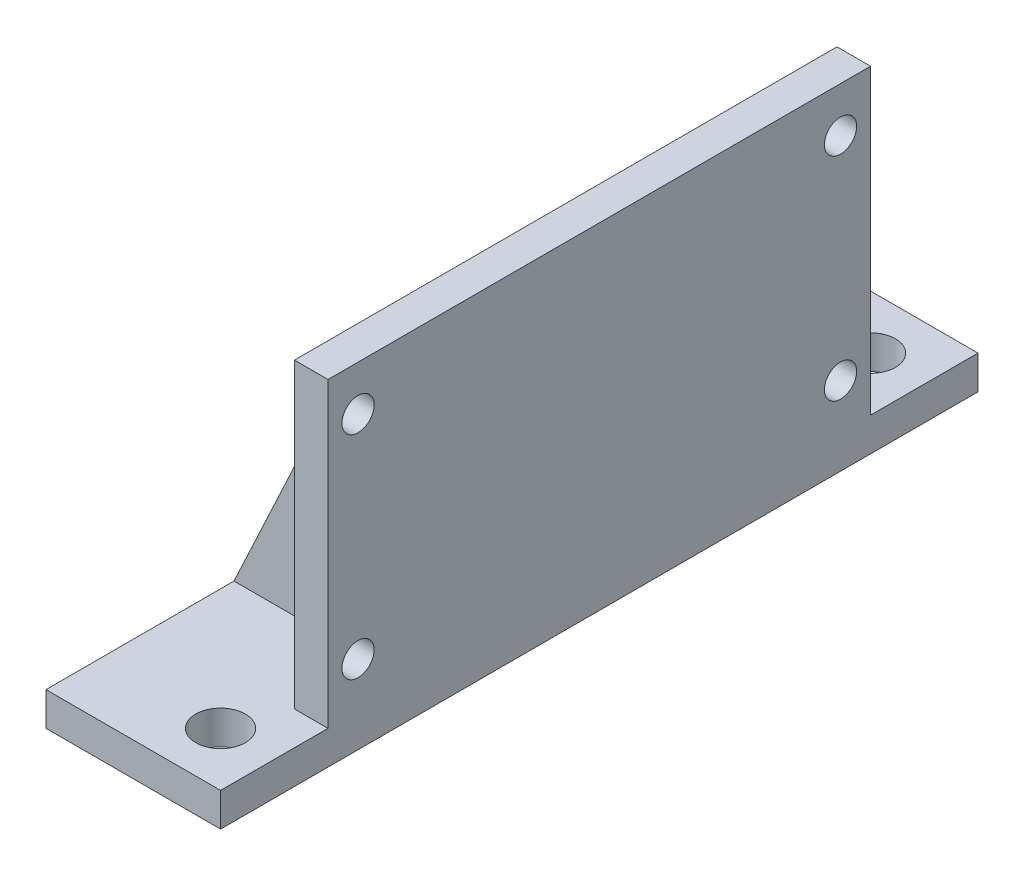
ISO-10303-21;
HEADER;
FILE_DESCRIPTION(('STEP AP214'),'2;1');
FILE_NAME('part.step','',(''),(''),'','','');
FILE_SCHEMA(('AUTOMOTIVE_DESIGN { 1 0 10303 214 1 1 1 1 }'));
ENDSEC;
DATA;
#1=APPLICATION_CONTEXT('core data for automotive mechanical design processes');
#2=APPLICATION_PROTOCOL_DEFINITION('international standard','automotive_design',2000,#1);
#3=PRODUCT_CONTEXT('',#1,'mechanical');
#4=PRODUCT('Part','Part','',(#3));
#5=PRODUCT_RELATED_PRODUCT_CATEGORY('part','',(#4));
#6=PRODUCT_DEFINITION_FORMATION('','',#4);
#7=PRODUCT_DEFINITION_CONTEXT('part definition',#1,'design');
#8=PRODUCT_DEFINITION('design','',#6,#7);
#9=PRODUCT_DEFINITION_SHAPE('','',#8);
#10=(LENGTH_UNIT() NAMED_UNIT(*) SI_UNIT(.MILLI.,.METRE.));
#11=(NAMED_UNIT(*) PLANE_ANGLE_UNIT() SI_UNIT($,.RADIAN.));
#12=(NAMED_UNIT(*) SI_UNIT($,.STERADIAN.) SOLID_ANGLE_UNIT());
#13=UNCERTAINTY_MEASURE_WITH_UNIT(LENGTH_MEASURE(1.E-05),#10,'distance_accuracy_value','');
#14=(GEOMETRIC_REPRESENTATION_CONTEXT(3) GLOBAL_UNCERTAINTY_ASSIGNED_CONTEXT((#13)) GLOBAL_UNIT_ASSIGNED_CONTEXT((#10,
#11,#12)) REPRESENTATION_CONTEXT('',''));
#15=CARTESIAN_POINT('',(0.,0.,0.));
#16=DIRECTION('',(0.,0.,1.));
#17=DIRECTION('',(1.,0.,0.));
#18=AXIS2_PLACEMENT_3D('',#15,#16,#17);
#19=CARTESIAN_POINT('',(0.,3.175,0.));
#20=DIRECTION('',(0.,1.,0.));
#21=DIRECTION('',(0.,0.,1.));
#22=AXIS2_PLACEMENT_3D('',#19,#20,#21);
#23=PLANE('',#22);
#24=DIRECTION('',(0.,0.,1.));
#25=VECTOR('',#24,1.);
#26=CARTESIAN_POINT('',(-11.43,3.175,0.));
#27=LINE('',#26,#25);
#28=CARTESIAN_POINT('',(-11.43,3.175,-46.232288028));
#29=VERTEX_POINT('',#28);
#30=CARTESIAN_POINT('',(-11.43,3.175,-15.24));
#31=VERTEX_POINT('',#30);
#32=EDGE_CURVE('E275',#29,#31,#27,.T.);
#33=ORIENTED_EDGE('',*,*,#32,.T.);
#34=DIRECTION('',(-1.,0.,0.));
#35=VECTOR('',#34,1.);
#36=CARTESIAN_POINT('',(0.,3.175,-15.24));
#37=LINE('',#36,#35);
#38=CARTESIAN_POINT('',(1.90500000000001,3.175,-15.24));
#39=VERTEX_POINT('',#38);
#40=EDGE_CURVE('E68',#39,#31,#37,.T.);
#41=ORIENTED_EDGE('',*,*,#40,.F.);
#42=DIRECTION('',(0.,0.,1.));
#43=VECTOR('',#42,1.);
#44=CARTESIAN_POINT('',(1.90500000000001,3.175,0.));
#45=LINE('',#44,#43);
#46=CARTESIAN_POINT('',(1.905,3.175,-46.232288028));
#47=VERTEX_POINT('',#46);
#48=EDGE_CURVE('E166',#47,#39,#45,.T.);
#49=ORIENTED_EDGE('',*,*,#48,.F.);
#50=DIRECTION('',(-1.,0.,0.));
#51=VECTOR('',#50,1.);
#52=CARTESIAN_POINT('',(0.,3.175,-46.232288028));
#53=LINE('',#52,#51);
#54=EDGE_CURVE('E195',#47,#29,#53,.T.);
#55=ORIENTED_EDGE('',*,*,#54,.T.);
#56=EDGE_LOOP('',(#33,#41,#49,#55));
#57=FACE_BOUND('',#56,.T.);
#58=ADVANCED_FACE('F45',(#57),#23,.T.);
#59=CARTESIAN_POINT('',(1.90500000000001,0.,0.));
#60=DIRECTION('',(1.,0.,0.));
#61=DIRECTION('',(0.,0.,-1.));
#62=AXIS2_PLACEMENT_3D('',#59,#60,#61);
#63=PLANE('',#62);
#64=DIRECTION('',(0.,1.,0.));
#65=VECTOR('',#64,1.);
#66=CARTESIAN_POINT('',(1.905,0.,-15.24));
#67=LINE('',#66,#65);
#68=CARTESIAN_POINT('',(1.905,31.75,-15.24));
#69=VERTEX_POINT('',#68);
#70=EDGE_CURVE('E164',#39,#69,#67,.T.);
#71=ORIENTED_EDGE('',*,*,#70,.T.);
#72=DIRECTION('',(0.,0.,-1.));
#73=VECTOR('',#72,1.);
#74=CARTESIAN_POINT('',(1.90500000000001,31.75,0.));
#75=LINE('',#74,#73);
#76=CARTESIAN_POINT('',(1.905,31.75,-46.232288028));
#77=VERTEX_POINT('',#76);
#78=EDGE_CURVE('E147',#69,#77,#75,.T.);
#79=ORIENTED_EDGE('',*,*,#78,.T.);
#80=DIRECTION('',(0.,1.,0.));
#81=VECTOR('',#80,1.);
#82=CARTESIAN_POINT('',(1.905,0.,-46.232288028));
#83=LINE('',#82,#81);
#84=EDGE_CURVE('E192',#47,#77,#83,.T.);
#85=ORIENTED_EDGE('',*,*,#84,.F.);
#86=ORIENTED_EDGE('',*,*,#48,.T.);
#87=EDGE_LOOP('',(#71,#79,#85,#86));
#88=FACE_BOUND('',#87,.T.);
#89=ADVANCED_FACE('F165',(#88),#63,.F.);
#90=DIRECTION('',(-1.,0.,0.));
#91=VECTOR('',#90,1.);
#92=CARTESIAN_POINT('',(0.,3.175,-12.7));
#93=LINE('',#92,#91);
#94=CARTESIAN_POINT('',(1.90500000000001,3.175,-12.7));
#95=VERTEX_POINT('',#94);
#96=CARTESIAN_POINT('',(-11.43,3.175,-12.7));
#97=VERTEX_POINT('',#96);
#98=EDGE_CURVE('E184',#95,#97,#93,.T.);
#99=ORIENTED_EDGE('',*,*,#98,.T.);
#100=CARTESIAN_POINT('',(-11.43,3.175,5.08));
#101=VERTEX_POINT('',#100);
#102=EDGE_CURVE('E270',#97,#101,#27,.T.);
#103=ORIENTED_EDGE('',*,*,#102,.T.);
#104=DIRECTION('',(-1.,0.,0.));
#105=VECTOR('',#104,1.);
#106=CARTESIAN_POINT('',(0.,3.175,5.08));
#107=LINE('',#106,#105);
#108=CARTESIAN_POINT('',(5.08,3.175,5.08));
#109=VERTEX_POINT('',#108);
#110=EDGE_CURVE('E260',#109,#101,#107,.T.);
#111=ORIENTED_EDGE('',*,*,#110,.F.);
#112=DIRECTION('',(0.,0.,-1.));
#113=VECTOR('',#112,1.);
#114=CARTESIAN_POINT('',(5.08000000000001,3.175,0.));
#115=LINE('',#114,#113);
#116=CARTESIAN_POINT('',(5.08000000000001,3.175,-5.08));
#117=VERTEX_POINT('',#116);
#118=EDGE_CURVE('E265',#109,#117,#115,.T.);
#119=ORIENTED_EDGE('',*,*,#118,.T.);
#120=DIRECTION('',(1.,0.,0.));
#121=VECTOR('',#120,1.);
#122=CARTESIAN_POINT('',(1.90500000000001,3.175,-5.08));
#123=LINE('',#122,#121);
#124=CARTESIAN_POINT('',(1.90500000000001,3.175,-5.08));
#125=VERTEX_POINT('',#124);
#126=EDGE_CURVE('E249',#125,#117,#123,.T.);
#127=ORIENTED_EDGE('',*,*,#126,.F.);
#128=EDGE_CURVE('E222',#95,#125,#45,.T.);
#129=ORIENTED_EDGE('',*,*,#128,.F.);
#130=EDGE_LOOP('',(#99,#103,#111,#119,#127,#129));
#131=FACE_BOUND('',#130,.T.);
#132=CARTESIAN_POINT('',(0.,3.175,0.));
#133=DIRECTION('',(0.,1.,0.));
#134=DIRECTION('',(0.,0.,1.));
#135=AXIS2_PLACEMENT_3D('',#132,#133,#134);
#136=CIRCLE('',#135,2.3495);
#137=CARTESIAN_POINT('',(0.,3.175,2.3495));
#138=VERTEX_POINT('',#137);
#139=EDGE_CURVE('E274',#138,#138,#136,.T.);
#140=ORIENTED_EDGE('',*,*,#139,.F.);
#141=EDGE_LOOP('',(#140));
#142=FACE_BOUND('',#141,.T.);
#143=ADVANCED_FACE('F341',(#131,#142),#23,.T.);
#144=CARTESIAN_POINT('',(1.90500000000001,7.4295,-7.92139043100001));
#145=DIRECTION('',(1.,0.,0.));
#146=DIRECTION('',(0.,0.,-1.));
#147=AXIS2_PLACEMENT_3D('',#144,#145,#146);
#148=CIRCLE('',#147,1.524);
#149=CARTESIAN_POINT('',(1.90500000000001,7.4295,-9.44539043100001));
#150=VERTEX_POINT('',#149);
#151=EDGE_CURVE('E209',#150,#150,#148,.T.);
#152=ORIENTED_EDGE('',*,*,#151,.T.);
#153=EDGE_LOOP('',(#152));
#154=FACE_BOUND('',#153,.T.);
#155=CARTESIAN_POINT('',(1.90500000000001,27.4955,-7.92139043100001));
#156=DIRECTION('',(1.,0.,0.));
#157=DIRECTION('',(0.,0.,-1.));
#158=AXIS2_PLACEMENT_3D('',#155,#156,#157);
#159=CIRCLE('',#158,1.524);
#160=CARTESIAN_POINT('',(1.90500000000001,27.4955,-9.44539043100001));
#161=VERTEX_POINT('',#160);
#162=EDGE_CURVE('E219',#161,#161,#159,.T.);
#163=ORIENTED_EDGE('',*,*,#162,.T.);
#164=EDGE_LOOP('',(#163));
#165=FACE_BOUND('',#164,.T.);
#166=CARTESIAN_POINT('',(1.90500000000001,31.75,-5.08));
#167=VERTEX_POINT('',#166);
#168=CARTESIAN_POINT('',(1.90500000000001,31.75,-12.7));
#169=VERTEX_POINT('',#168);
#170=EDGE_CURVE('E160',#167,#169,#75,.T.);
#171=ORIENTED_EDGE('',*,*,#170,.T.);
#172=DIRECTION('',(0.,1.,0.));
#173=VECTOR('',#172,1.);
#174=CARTESIAN_POINT('',(1.905,0.,-12.7));
#175=LINE('',#174,#173);
#176=EDGE_CURVE('E60',#95,#169,#175,.T.);
#177=ORIENTED_EDGE('',*,*,#176,.F.);
#178=ORIENTED_EDGE('',*,*,#128,.T.);
#179=DIRECTION('',(0.,1.,0.));
#180=VECTOR('',#179,1.);
#181=CARTESIAN_POINT('',(1.90500000000001,0.,-5.08));
#182=LINE('',#181,#180);
#183=EDGE_CURVE('E229',#125,#167,#182,.T.);
#184=ORIENTED_EDGE('',*,*,#183,.T.);
#185=EDGE_LOOP('',(#171,#177,#178,#184));
#186=FACE_BOUND('',#185,.T.);
#187=ADVANCED_FACE('F345',(#154,#165,#186),#63,.F.);
#188=CARTESIAN_POINT('',(0.,3.175,5.08));
#189=DIRECTION('',(0.,0.,1.));
#190=DIRECTION('',(1.,0.,0.));
#191=AXIS2_PLACEMENT_3D('',#188,#189,#190);
#192=PLANE('',#191);
#193=DIRECTION('',(-1.,0.,0.));
#194=VECTOR('',#193,1.);
#195=CARTESIAN_POINT('',(0.,0.,5.08));
#196=LINE('',#195,#194);
#197=CARTESIAN_POINT('',(5.08,0.,5.08));
#198=VERTEX_POINT('',#197);
#199=CARTESIAN_POINT('',(-11.43,0.,5.08));
#200=VERTEX_POINT('',#199);
#201=EDGE_CURVE('E252',#198,#200,#196,.T.);
#202=ORIENTED_EDGE('',*,*,#201,.F.);
#203=DIRECTION('',(0.,-1.,0.));
#204=VECTOR('',#203,1.);
#205=CARTESIAN_POINT('',(5.08,3.175,5.08));
#206=LINE('',#205,#204);
#207=EDGE_CURVE('E11',#109,#198,#206,.T.);
#208=ORIENTED_EDGE('',*,*,#207,.F.);
#209=ORIENTED_EDGE('',*,*,#110,.T.);
#210=DIRECTION('',(0.,-1.,0.));
#211=VECTOR('',#210,1.);
#212=CARTESIAN_POINT('',(-11.43,3.175,5.08));
#213=LINE('',#212,#211);
#214=EDGE_CURVE('E281',#101,#200,#213,.T.);
#215=ORIENTED_EDGE('',*,*,#214,.T.);
#216=EDGE_LOOP('',(#202,#208,#209,#215));
#217=FACE_BOUND('',#216,.T.);
#218=ADVANCED_FACE('F47',(#217),#192,.T.);
#219=CARTESIAN_POINT('',(5.08000000000001,3.175,0.));
#220=DIRECTION('',(-1.,0.,0.));
#221=DIRECTION('',(0.,0.,1.));
#222=AXIS2_PLACEMENT_3D('',#219,#220,#221);
#223=PLANE('',#222);
#224=DIRECTION('',(0.,0.,-1.));
#225=VECTOR('',#224,1.);
#226=CARTESIAN_POINT('',(5.08000000000001,0.,0.));
#227=LINE('',#226,#225);
#228=CARTESIAN_POINT('',(5.08,0.,-66.552288028));
#229=VERTEX_POINT('',#228);
#230=EDGE_CURVE('E284',#198,#229,#227,.T.);
#231=ORIENTED_EDGE('',*,*,#230,.T.);
#232=DIRECTION('',(0.,-1.,0.));
#233=VECTOR('',#232,1.);
#234=CARTESIAN_POINT('',(5.08,3.175,-66.552288028));
#235=LINE('',#234,#233);
#236=CARTESIAN_POINT('',(5.08,3.175,-66.552288028));
#237=VERTEX_POINT('',#236);
#238=EDGE_CURVE('E53',#237,#229,#235,.T.);
#239=ORIENTED_EDGE('',*,*,#238,.F.);
#240=CARTESIAN_POINT('',(5.08,3.175,-56.392288028));
#241=VERTEX_POINT('',#240);
#242=EDGE_CURVE('E263',#241,#237,#115,.T.);
#243=ORIENTED_EDGE('',*,*,#242,.F.);
#244=DIRECTION('',(0.,1.,0.));
#245=VECTOR('',#244,1.);
#246=CARTESIAN_POINT('',(5.08,0.,-56.392288028));
#247=LINE('',#246,#245);
#248=CARTESIAN_POINT('',(5.08,31.75,-56.392288028));
#249=VERTEX_POINT('',#248);
#250=EDGE_CURVE('E243',#241,#249,#247,.T.);
#251=ORIENTED_EDGE('',*,*,#250,.T.);
#252=DIRECTION('',(0.,0.,-1.));
#253=VECTOR('',#252,1.);
#254=CARTESIAN_POINT('',(5.08000000000001,31.75,0.));
#255=LINE('',#254,#253);
#256=CARTESIAN_POINT('',(5.08000000000001,31.75,-5.08));
#257=VERTEX_POINT('',#256);
#258=EDGE_CURVE('E246',#257,#249,#255,.T.);
#259=ORIENTED_EDGE('',*,*,#258,.F.);
#260=DIRECTION('',(0.,1.,0.));
#261=VECTOR('',#260,1.);
#262=CARTESIAN_POINT('',(5.08000000000001,0.,-5.08));
#263=LINE('',#262,#261);
#264=EDGE_CURVE('E213',#117,#257,#263,.T.);
#265=ORIENTED_EDGE('',*,*,#264,.F.);
#266=ORIENTED_EDGE('',*,*,#118,.F.);
#267=ORIENTED_EDGE('',*,*,#207,.T.);
#268=EDGE_LOOP('',(#231,#239,#243,#251,#259,#265,#266,#267));
#269=FACE_BOUND('',#268,.T.);
#270=CARTESIAN_POINT('',(5.08000000000001,7.4295,-7.92139043100001));
#271=DIRECTION('',(1.,0.,0.));
#272=DIRECTION('',(0.,0.,-1.));
#273=AXIS2_PLACEMENT_3D('',#270,#271,#272);
#274=CIRCLE('',#273,1.524);
#275=CARTESIAN_POINT('',(5.08000000000001,7.4295,-9.44539043100001));
#276=VERTEX_POINT('',#275);
#277=EDGE_CURVE('E207',#276,#276,#274,.T.);
#278=ORIENTED_EDGE('',*,*,#277,.F.);
#279=EDGE_LOOP('',(#278));
#280=FACE_BOUND('',#279,.T.);
#281=CARTESIAN_POINT('',(5.08,7.4295,-53.550897597));
#282=DIRECTION('',(1.,0.,0.));
#283=DIRECTION('',(0.,0.,-1.));
#284=AXIS2_PLACEMENT_3D('',#281,#282,#283);
#285=CIRCLE('',#284,1.52400000000001);
#286=CARTESIAN_POINT('',(5.08,7.4295,-55.074897597));
#287=VERTEX_POINT('',#286);
#288=EDGE_CURVE('E234',#287,#287,#285,.T.);
#289=ORIENTED_EDGE('',*,*,#288,.F.);
#290=EDGE_LOOP('',(#289));
#291=FACE_BOUND('',#290,.T.);
#292=CARTESIAN_POINT('',(5.08,27.4955,-53.550897597));
#293=DIRECTION('',(1.,0.,0.));
#294=DIRECTION('',(0.,0.,-1.));
#295=AXIS2_PLACEMENT_3D('',#292,#293,#294);
#296=CIRCLE('',#295,1.52400000000001);
#297=CARTESIAN_POINT('',(5.08,27.4955,-55.074897597));
#298=VERTEX_POINT('',#297);
#299=EDGE_CURVE('E237',#298,#298,#296,.T.);
#300=ORIENTED_EDGE('',*,*,#299,.F.);
#301=EDGE_LOOP('',(#300));
#302=FACE_BOUND('',#301,.T.);
#303=CARTESIAN_POINT('',(5.08000000000001,27.4955,-7.92139043100001));
#304=DIRECTION('',(1.,0.,0.));
#305=DIRECTION('',(0.,0.,-1.));
#306=AXIS2_PLACEMENT_3D('',#303,#304,#305);
#307=CIRCLE('',#306,1.524);
#308=CARTESIAN_POINT('',(5.08000000000001,27.4955,-9.44539043100001));
#309=VERTEX_POINT('',#308);
#310=EDGE_CURVE('E240',#309,#309,#307,.T.);
#311=ORIENTED_EDGE('',*,*,#310,.F.);
#312=EDGE_LOOP('',(#311));
#313=FACE_BOUND('',#312,.T.);
#314=ADVANCED_FACE('F326',(#269,#280,#291,#302,#313),#223,.F.);
#315=CARTESIAN_POINT('',(0.,3.175,-66.552288028));
#316=DIRECTION('',(0.,0.,1.));
#317=DIRECTION('',(1.,0.,0.));
#318=AXIS2_PLACEMENT_3D('',#315,#316,#317);
#319=PLANE('',#318);
#320=DIRECTION('',(-1.,0.,0.));
#321=VECTOR('',#320,1.);
#322=CARTESIAN_POINT('',(0.,0.,-66.552288028));
#323=LINE('',#322,#321);
#324=CARTESIAN_POINT('',(-11.43,0.,-66.552288028));
#325=VERTEX_POINT('',#324);
#326=EDGE_CURVE('E286',#229,#325,#323,.T.);
#327=ORIENTED_EDGE('',*,*,#326,.T.);
#328=DIRECTION('',(0.,-1.,0.));
#329=VECTOR('',#328,1.);
#330=CARTESIAN_POINT('',(-11.43,3.175,-66.552288028));
#331=LINE('',#330,#329);
#332=CARTESIAN_POINT('',(-11.43,3.175,-66.552288028));
#333=VERTEX_POINT('',#332);
#334=EDGE_CURVE('E297',#333,#325,#331,.T.);
#335=ORIENTED_EDGE('',*,*,#334,.F.);
#336=DIRECTION('',(-1.,0.,0.));
#337=VECTOR('',#336,1.);
#338=CARTESIAN_POINT('',(0.,3.175,-66.552288028));
#339=LINE('',#338,#337);
#340=EDGE_CURVE('E268',#237,#333,#339,.T.);
#341=ORIENTED_EDGE('',*,*,#340,.F.);
#342=ORIENTED_EDGE('',*,*,#238,.T.);
#343=EDGE_LOOP('',(#327,#335,#341,#342));
#344=FACE_BOUND('',#343,.T.);
#345=ADVANCED_FACE('F304',(#344),#319,.F.);
#346=CARTESIAN_POINT('',(0.,3.175,0.));
#347=DIRECTION('',(0.,-1.,0.));
#348=DIRECTION('',(0.,0.,-1.));
#349=AXIS2_PLACEMENT_3D('',#346,#347,#348);
#350=CYLINDRICAL_SURFACE('',#349,2.3495);
#351=ORIENTED_EDGE('',*,*,#139,.T.);
#352=EDGE_LOOP('',(#351));
#353=FACE_BOUND('',#352,.T.);
#354=CARTESIAN_POINT('',(0.,0.,0.));
#355=DIRECTION('',(0.,1.,0.));
#356=DIRECTION('',(0.,0.,1.));
#357=AXIS2_PLACEMENT_3D('',#354,#355,#356);
#358=CIRCLE('',#357,2.3495);
#359=CARTESIAN_POINT('',(0.,0.,2.3495));
#360=VERTEX_POINT('',#359);
#361=EDGE_CURVE('E291',#360,#360,#358,.T.);
#362=ORIENTED_EDGE('',*,*,#361,.F.);
#363=EDGE_LOOP('',(#362));
#364=FACE_BOUND('',#363,.T.);
#365=ADVANCED_FACE('F377',(#353,#364),#350,.F.);
#366=CARTESIAN_POINT('',(-11.43,3.175,0.));
#367=DIRECTION('',(1.,0.,0.));
#368=DIRECTION('',(0.,0.,-1.));
#369=AXIS2_PLACEMENT_3D('',#366,#367,#368);
#370=PLANE('',#369);
#371=DIRECTION('',(0.,0.,1.));
#372=VECTOR('',#371,1.);
#373=CARTESIAN_POINT('',(-11.43,0.,0.));
#374=LINE('',#373,#372);
#375=EDGE_CURVE('E288',#325,#200,#374,.T.);
#376=ORIENTED_EDGE('',*,*,#375,.T.);
#377=ORIENTED_EDGE('',*,*,#214,.F.);
#378=ORIENTED_EDGE('',*,*,#102,.F.);
#379=DIRECTION('',(0.,0.,1.));
#380=VECTOR('',#379,1.);
#381=CARTESIAN_POINT('',(-11.43,3.175,-15.24));
#382=LINE('',#381,#380);
#383=EDGE_CURVE('E169',#31,#97,#382,.T.);
#384=ORIENTED_EDGE('',*,*,#383,.F.);
#385=ORIENTED_EDGE('',*,*,#32,.F.);
#386=DIRECTION('',(0.,0.,-1.));
#387=VECTOR('',#386,1.);
#388=CARTESIAN_POINT('',(-11.43,3.175,-46.232288028));
#389=LINE('',#388,#387);
#390=CARTESIAN_POINT('',(-11.43,3.175,-48.772288028));
#391=VERTEX_POINT('',#390);
#392=EDGE_CURVE('E204',#29,#391,#389,.T.);
#393=ORIENTED_EDGE('',*,*,#392,.T.);
#394=EDGE_CURVE('E271',#333,#391,#27,.T.);
#395=ORIENTED_EDGE('',*,*,#394,.F.);
#396=ORIENTED_EDGE('',*,*,#334,.T.);
#397=EDGE_LOOP('',(#376,#377,#378,#384,#385,#393,#395,#396));
#398=FACE_BOUND('',#397,.T.);
#399=ADVANCED_FACE('F316',(#398),#370,.F.);
#400=CARTESIAN_POINT('',(0.,3.175,-61.472288028));
#401=DIRECTION('',(0.,-1.,0.));
#402=DIRECTION('',(0.,0.,-1.));
#403=AXIS2_PLACEMENT_3D('',#400,#401,#402);
#404=CYLINDRICAL_SURFACE('',#403,2.3495);
#405=CARTESIAN_POINT('',(0.,3.175,-61.472288028));
#406=DIRECTION('',(0.,1.,0.));
#407=DIRECTION('',(0.,0.,1.));
#408=AXIS2_PLACEMENT_3D('',#405,#406,#407);
#409=CIRCLE('',#408,2.3495);
#410=CARTESIAN_POINT('',(0.,3.175,-59.122788028));
#411=VERTEX_POINT('',#410);
#412=EDGE_CURVE('E278',#411,#411,#409,.T.);
#413=ORIENTED_EDGE('',*,*,#412,.T.);
#414=EDGE_LOOP('',(#413));
#415=FACE_BOUND('',#414,.T.);
#416=CARTESIAN_POINT('',(0.,0.,-61.472288028));
#417=DIRECTION('',(0.,1.,0.));
#418=DIRECTION('',(0.,0.,1.));
#419=AXIS2_PLACEMENT_3D('',#416,#417,#418);
#420=CIRCLE('',#419,2.3495);
#421=CARTESIAN_POINT('',(0.,0.,-59.122788028));
#422=VERTEX_POINT('',#421);
#423=EDGE_CURVE('E264',#422,#422,#420,.T.);
#424=ORIENTED_EDGE('',*,*,#423,.F.);
#425=EDGE_LOOP('',(#424));
#426=FACE_BOUND('',#425,.T.);
#427=ADVANCED_FACE('F364',(#415,#426),#404,.F.);
#428=DIRECTION('',(-1.,0.,0.));
#429=VECTOR('',#428,1.);
#430=CARTESIAN_POINT('',(0.,3.175,-48.772288028));
#431=LINE('',#430,#429);
#432=CARTESIAN_POINT('',(1.905,3.175,-48.772288028));
#433=VERTEX_POINT('',#432);
#434=EDGE_CURVE('E193',#433,#391,#431,.T.);
#435=ORIENTED_EDGE('',*,*,#434,.F.);
#436=CARTESIAN_POINT('',(1.905,3.175,-56.392288028));
#437=VERTEX_POINT('',#436);
#438=EDGE_CURVE('E223',#437,#433,#45,.T.);
#439=ORIENTED_EDGE('',*,*,#438,.F.);
#440=DIRECTION('',(1.,0.,0.));
#441=VECTOR('',#440,1.);
#442=CARTESIAN_POINT('',(1.905,3.175,-56.392288028));
#443=LINE('',#442,#441);
#444=EDGE_CURVE('E231',#437,#241,#443,.T.);
#445=ORIENTED_EDGE('',*,*,#444,.T.);
#446=ORIENTED_EDGE('',*,*,#242,.T.);
#447=ORIENTED_EDGE('',*,*,#340,.T.);
#448=ORIENTED_EDGE('',*,*,#394,.T.);
#449=EDGE_LOOP('',(#435,#439,#445,#446,#447,#448));
#450=FACE_BOUND('',#449,.T.);
#451=ORIENTED_EDGE('',*,*,#412,.F.);
#452=EDGE_LOOP('',(#451));
#453=FACE_BOUND('',#452,.T.);
#454=ADVANCED_FACE('F323',(#450,#453),#23,.T.);
#455=CARTESIAN_POINT('',(0.,0.,0.));
#456=DIRECTION('',(0.,1.,0.));
#457=DIRECTION('',(0.,0.,1.));
#458=AXIS2_PLACEMENT_3D('',#455,#456,#457);
#459=PLANE('',#458);
#460=ORIENTED_EDGE('',*,*,#201,.T.);
#461=ORIENTED_EDGE('',*,*,#375,.F.);
#462=ORIENTED_EDGE('',*,*,#326,.F.);
#463=ORIENTED_EDGE('',*,*,#230,.F.);
#464=EDGE_LOOP('',(#460,#461,#462,#463));
#465=FACE_BOUND('',#464,.T.);
#466=ORIENTED_EDGE('',*,*,#361,.T.);
#467=EDGE_LOOP('',(#466));
#468=FACE_BOUND('',#467,.T.);
#469=ORIENTED_EDGE('',*,*,#423,.T.);
#470=EDGE_LOOP('',(#469));
#471=FACE_BOUND('',#470,.T.);
#472=ADVANCED_FACE('F311',(#465,#468,#471),#459,.F.);
#473=CARTESIAN_POINT('',(1.90500000000001,0.,-5.08));
#474=DIRECTION('',(0.,0.,-1.));
#475=DIRECTION('',(-1.,0.,0.));
#476=AXIS2_PLACEMENT_3D('',#473,#474,#475);
#477=PLANE('',#476);
#478=ORIENTED_EDGE('',*,*,#264,.T.);
#479=DIRECTION('',(1.,0.,0.));
#480=VECTOR('',#479,1.);
#481=CARTESIAN_POINT('',(1.90500000000001,31.75,-5.08));
#482=LINE('',#481,#480);
#483=EDGE_CURVE('E253',#167,#257,#482,.T.);
#484=ORIENTED_EDGE('',*,*,#483,.F.);
#485=ORIENTED_EDGE('',*,*,#183,.F.);
#486=ORIENTED_EDGE('',*,*,#126,.T.);
#487=EDGE_LOOP('',(#478,#484,#485,#486));
#488=FACE_BOUND('',#487,.T.);
#489=ADVANCED_FACE('F336',(#488),#477,.F.);
#490=CARTESIAN_POINT('',(1.90500000000001,31.75,0.));
#491=DIRECTION('',(0.,-1.,0.));
#492=DIRECTION('',(0.,0.,-1.));
#493=AXIS2_PLACEMENT_3D('',#490,#491,#492);
#494=PLANE('',#493);
#495=ORIENTED_EDGE('',*,*,#258,.T.);
#496=DIRECTION('',(1.,0.,0.));
#497=VECTOR('',#496,1.);
#498=CARTESIAN_POINT('',(1.905,31.75,-56.392288028));
#499=LINE('',#498,#497);
#500=CARTESIAN_POINT('',(1.905,31.75,-56.392288028));
#501=VERTEX_POINT('',#500);
#502=EDGE_CURVE('E256',#501,#249,#499,.T.);
#503=ORIENTED_EDGE('',*,*,#502,.F.);
#504=CARTESIAN_POINT('',(1.905,31.75,-48.772288028));
#505=VERTEX_POINT('',#504);
#506=EDGE_CURVE('E161',#505,#501,#75,.T.);
#507=ORIENTED_EDGE('',*,*,#506,.F.);
#508=DIRECTION('',(0.,0.,-1.));
#509=VECTOR('',#508,1.);
#510=CARTESIAN_POINT('',(1.905,31.75,-46.232288028));
#511=LINE('',#510,#509);
#512=EDGE_CURVE('E156',#77,#505,#511,.T.);
#513=ORIENTED_EDGE('',*,*,#512,.F.);
#514=ORIENTED_EDGE('',*,*,#78,.F.);
#515=DIRECTION('',(0.,0.,1.));
#516=VECTOR('',#515,1.);
#517=CARTESIAN_POINT('',(1.905,31.75,-15.24));
#518=LINE('',#517,#516);
#519=EDGE_CURVE('E153',#69,#169,#518,.T.);
#520=ORIENTED_EDGE('',*,*,#519,.T.);
#521=ORIENTED_EDGE('',*,*,#170,.F.);
#522=ORIENTED_EDGE('',*,*,#483,.T.);
#523=EDGE_LOOP('',(#495,#503,#507,#513,#514,#520,#521,#522));
#524=FACE_BOUND('',#523,.T.);
#525=ADVANCED_FACE('F150',(#524),#494,.F.);
#526=CARTESIAN_POINT('',(1.90500000000001,27.4955,-7.92139043100001));
#527=DIRECTION('',(1.,0.,0.));
#528=DIRECTION('',(0.,0.,-1.));
#529=AXIS2_PLACEMENT_3D('',#526,#527,#528);
#530=CYLINDRICAL_SURFACE('',#529,1.524);
#531=ORIENTED_EDGE('',*,*,#162,.F.);
#532=EDGE_LOOP('',(#531));
#533=FACE_BOUND('',#532,.T.);
#534=ORIENTED_EDGE('',*,*,#310,.T.);
#535=EDGE_LOOP('',(#534));
#536=FACE_BOUND('',#535,.T.);
#537=ADVANCED_FACE('F468',(#533,#536),#530,.F.);
#538=CARTESIAN_POINT('',(1.905,27.4955,-53.550897597));
#539=DIRECTION('',(1.,0.,0.));
#540=DIRECTION('',(0.,0.,-1.));
#541=AXIS2_PLACEMENT_3D('',#538,#539,#540);
#542=CYLINDRICAL_SURFACE('',#541,1.52400000000001);
#543=CARTESIAN_POINT('',(1.905,27.4955,-53.550897597));
#544=DIRECTION('',(1.,0.,0.));
#545=DIRECTION('',(0.,0.,-1.));
#546=AXIS2_PLACEMENT_3D('',#543,#544,#545);
#547=CIRCLE('',#546,1.52400000000001);
#548=CARTESIAN_POINT('',(1.905,27.4955,-55.074897597));
#549=VERTEX_POINT('',#548);
#550=EDGE_CURVE('E216',#549,#549,#547,.T.);
#551=ORIENTED_EDGE('',*,*,#550,.F.);
#552=EDGE_LOOP('',(#551));
#553=FACE_BOUND('',#552,.T.);
#554=ORIENTED_EDGE('',*,*,#299,.T.);
#555=EDGE_LOOP('',(#554));
#556=FACE_BOUND('',#555,.T.);
#557=ADVANCED_FACE('F477',(#553,#556),#542,.F.);
#558=CARTESIAN_POINT('',(1.905,7.4295,-53.550897597));
#559=DIRECTION('',(1.,0.,0.));
#560=DIRECTION('',(0.,0.,-1.));
#561=AXIS2_PLACEMENT_3D('',#558,#559,#560);
#562=CYLINDRICAL_SURFACE('',#561,1.52400000000001);
#563=CARTESIAN_POINT('',(1.905,7.4295,-53.550897597));
#564=DIRECTION('',(1.,0.,0.));
#565=DIRECTION('',(0.,0.,-1.));
#566=AXIS2_PLACEMENT_3D('',#563,#564,#565);
#567=CIRCLE('',#566,1.52400000000001);
#568=CARTESIAN_POINT('',(1.905,7.4295,-55.074897597));
#569=VERTEX_POINT('',#568);
#570=EDGE_CURVE('E212',#569,#569,#567,.T.);
#571=ORIENTED_EDGE('',*,*,#570,.F.);
#572=EDGE_LOOP('',(#571));
#573=FACE_BOUND('',#572,.T.);
#574=ORIENTED_EDGE('',*,*,#288,.T.);
#575=EDGE_LOOP('',(#574));
#576=FACE_BOUND('',#575,.T.);
#577=ADVANCED_FACE('F487',(#573,#576),#562,.F.);
#578=CARTESIAN_POINT('',(1.90500000000001,7.4295,-7.92139043100001));
#579=DIRECTION('',(1.,0.,0.));
#580=DIRECTION('',(0.,0.,-1.));
#581=AXIS2_PLACEMENT_3D('',#578,#579,#580);
#582=CYLINDRICAL_SURFACE('',#581,1.524);
#583=ORIENTED_EDGE('',*,*,#151,.F.);
#584=EDGE_LOOP('',(#583));
#585=FACE_BOUND('',#584,.T.);
#586=ORIENTED_EDGE('',*,*,#277,.T.);
#587=EDGE_LOOP('',(#586));
#588=FACE_BOUND('',#587,.T.);
#589=ADVANCED_FACE('F497',(#585,#588),#582,.F.);
#590=CARTESIAN_POINT('',(1.905,0.,-56.392288028));
#591=DIRECTION('',(0.,0.,-1.));
#592=DIRECTION('',(-1.,0.,0.));
#593=AXIS2_PLACEMENT_3D('',#590,#591,#592);
#594=PLANE('',#593);
#595=ORIENTED_EDGE('',*,*,#250,.F.);
#596=ORIENTED_EDGE('',*,*,#444,.F.);
#597=DIRECTION('',(0.,1.,0.));
#598=VECTOR('',#597,1.);
#599=CARTESIAN_POINT('',(1.905,0.,-56.392288028));
#600=LINE('',#599,#598);
#601=EDGE_CURVE('E226',#437,#501,#600,.T.);
#602=ORIENTED_EDGE('',*,*,#601,.T.);
#603=ORIENTED_EDGE('',*,*,#502,.T.);
#604=EDGE_LOOP('',(#595,#596,#602,#603));
#605=FACE_BOUND('',#604,.T.);
#606=ADVANCED_FACE('F330',(#605),#594,.T.);
#607=ORIENTED_EDGE('',*,*,#570,.T.);
#608=EDGE_LOOP('',(#607));
#609=FACE_BOUND('',#608,.T.);
#610=ORIENTED_EDGE('',*,*,#550,.T.);
#611=EDGE_LOOP('',(#610));
#612=FACE_BOUND('',#611,.T.);
#613=ORIENTED_EDGE('',*,*,#438,.T.);
#614=DIRECTION('',(0.,1.,0.));
#615=VECTOR('',#614,1.);
#616=CARTESIAN_POINT('',(1.905,0.,-48.772288028));
#617=LINE('',#616,#615);
#618=EDGE_CURVE('E199',#433,#505,#617,.T.);
#619=ORIENTED_EDGE('',*,*,#618,.T.);
#620=ORIENTED_EDGE('',*,*,#506,.T.);
#621=ORIENTED_EDGE('',*,*,#601,.F.);
#622=EDGE_LOOP('',(#613,#619,#620,#621));
#623=FACE_BOUND('',#622,.T.);
#624=ADVANCED_FACE('F353',(#609,#612,#623),#63,.F.);
#625=CARTESIAN_POINT('',(-10.6026459854015,4.94790145985401,-46.232288028));
#626=DIRECTION('',(0.906183139995265,-0.422885465331124,0.));
#627=DIRECTION('',(0.422885465331124,0.906183139995265,0.));
#628=AXIS2_PLACEMENT_3D('',#625,#626,#627);
#629=PLANE('',#628);
#630=DIRECTION('',(-0.422885465331124,-0.906183139995265,0.));
#631=VECTOR('',#630,1.);
#632=CARTESIAN_POINT('',(-10.6026459854015,4.94790145985401,-48.772288028));
#633=LINE('',#632,#631);
#634=EDGE_CURVE('E179',#505,#391,#633,.T.);
#635=ORIENTED_EDGE('',*,*,#634,.T.);
#636=ORIENTED_EDGE('',*,*,#392,.F.);
#637=DIRECTION('',(-0.422885465331124,-0.906183139995265,0.));
#638=VECTOR('',#637,1.);
#639=CARTESIAN_POINT('',(-10.6026459854015,4.94790145985401,-46.232288028));
#640=LINE('',#639,#638);
#641=EDGE_CURVE('E190',#77,#29,#640,.T.);
#642=ORIENTED_EDGE('',*,*,#641,.F.);
#643=ORIENTED_EDGE('',*,*,#512,.T.);
#644=EDGE_LOOP('',(#635,#636,#642,#643));
#645=FACE_BOUND('',#644,.T.);
#646=ADVANCED_FACE('F521',(#645),#629,.F.);
#647=CARTESIAN_POINT('',(0.,0.,-46.232288028));
#648=DIRECTION('',(0.,0.,-1.));
#649=DIRECTION('',(-1.,0.,0.));
#650=AXIS2_PLACEMENT_3D('',#647,#648,#649);
#651=PLANE('',#650);
#652=ORIENTED_EDGE('',*,*,#641,.T.);
#653=ORIENTED_EDGE('',*,*,#54,.F.);
#654=ORIENTED_EDGE('',*,*,#84,.T.);
#655=EDGE_LOOP('',(#652,#653,#654));
#656=FACE_BOUND('',#655,.T.);
#657=ADVANCED_FACE('F557',(#656),#651,.F.);
#658=CARTESIAN_POINT('',(0.,0.,-48.772288028));
#659=DIRECTION('',(0.,0.,-1.));
#660=DIRECTION('',(-1.,0.,0.));
#661=AXIS2_PLACEMENT_3D('',#658,#659,#660);
#662=PLANE('',#661);
#663=ORIENTED_EDGE('',*,*,#634,.F.);
#664=ORIENTED_EDGE('',*,*,#618,.F.);
#665=ORIENTED_EDGE('',*,*,#434,.T.);
#666=EDGE_LOOP('',(#663,#664,#665));
#667=FACE_BOUND('',#666,.T.);
#668=ADVANCED_FACE('F567',(#667),#662,.T.);
#669=CARTESIAN_POINT('',(-10.6026459854015,4.94790145985401,-15.24));
#670=DIRECTION('',(-0.906183139995265,0.422885465331124,0.));
#671=DIRECTION('',(-0.422885465331124,-0.906183139995265,0.));
#672=AXIS2_PLACEMENT_3D('',#669,#670,#671);
#673=PLANE('',#672);
#674=DIRECTION('',(-0.422885465331124,-0.906183139995265,0.));
#675=VECTOR('',#674,1.);
#676=CARTESIAN_POINT('',(-10.6026459854015,4.94790145985401,-12.7));
#677=LINE('',#676,#675);
#678=EDGE_CURVE('E178',#169,#97,#677,.T.);
#679=ORIENTED_EDGE('',*,*,#678,.F.);
#680=ORIENTED_EDGE('',*,*,#519,.F.);
#681=DIRECTION('',(-0.422885465331124,-0.906183139995265,0.));
#682=VECTOR('',#681,1.);
#683=CARTESIAN_POINT('',(-10.6026459854015,4.94790145985401,-15.24));
#684=LINE('',#683,#682);
#685=EDGE_CURVE('E176',#69,#31,#684,.T.);
#686=ORIENTED_EDGE('',*,*,#685,.T.);
#687=ORIENTED_EDGE('',*,*,#383,.T.);
#688=EDGE_LOOP('',(#679,#680,#686,#687));
#689=FACE_BOUND('',#688,.T.);
#690=ADVANCED_FACE('F174',(#689),#673,.T.);
#691=CARTESIAN_POINT('',(0.,0.,-15.24));
#692=DIRECTION('',(0.,0.,1.));
#693=DIRECTION('',(-1.,0.,0.));
#694=AXIS2_PLACEMENT_3D('',#691,#692,#693);
#695=PLANE('',#694);
#696=ORIENTED_EDGE('',*,*,#685,.F.);
#697=ORIENTED_EDGE('',*,*,#70,.F.);
#698=ORIENTED_EDGE('',*,*,#40,.T.);
#699=EDGE_LOOP('',(#696,#697,#698));
#700=FACE_BOUND('',#699,.T.);
#701=ADVANCED_FACE('F181',(#700),#695,.F.);
#702=CARTESIAN_POINT('',(0.,0.,-12.7));
#703=DIRECTION('',(0.,0.,1.));
#704=DIRECTION('',(-1.,0.,0.));
#705=AXIS2_PLACEMENT_3D('',#702,#703,#704);
#706=PLANE('',#705);
#707=ORIENTED_EDGE('',*,*,#678,.T.);
#708=ORIENTED_EDGE('',*,*,#98,.F.);
#709=ORIENTED_EDGE('',*,*,#176,.T.);
#710=EDGE_LOOP('',(#707,#708,#709));
#711=FACE_BOUND('',#710,.T.);
#712=ADVANCED_FACE('F617',(#711),#706,.T.);
#713=CLOSED_SHELL('',(#58,#89,#143,#187,#218,#314,#345,#365,#399,#427,#454,#472,#489,#525,#537,
#557,#577,#589,#606,#624,#646,#657,#668,#690,#701,#712));
#714=MANIFOLD_SOLID_BREP('B2',#713);
#715=ADVANCED_BREP_SHAPE_REPRESENTATION('',(#18,#714),#14);
#716=SHAPE_DEFINITION_REPRESENTATION(#9,#715);
ENDSEC;
END-ISO-10303-21;
